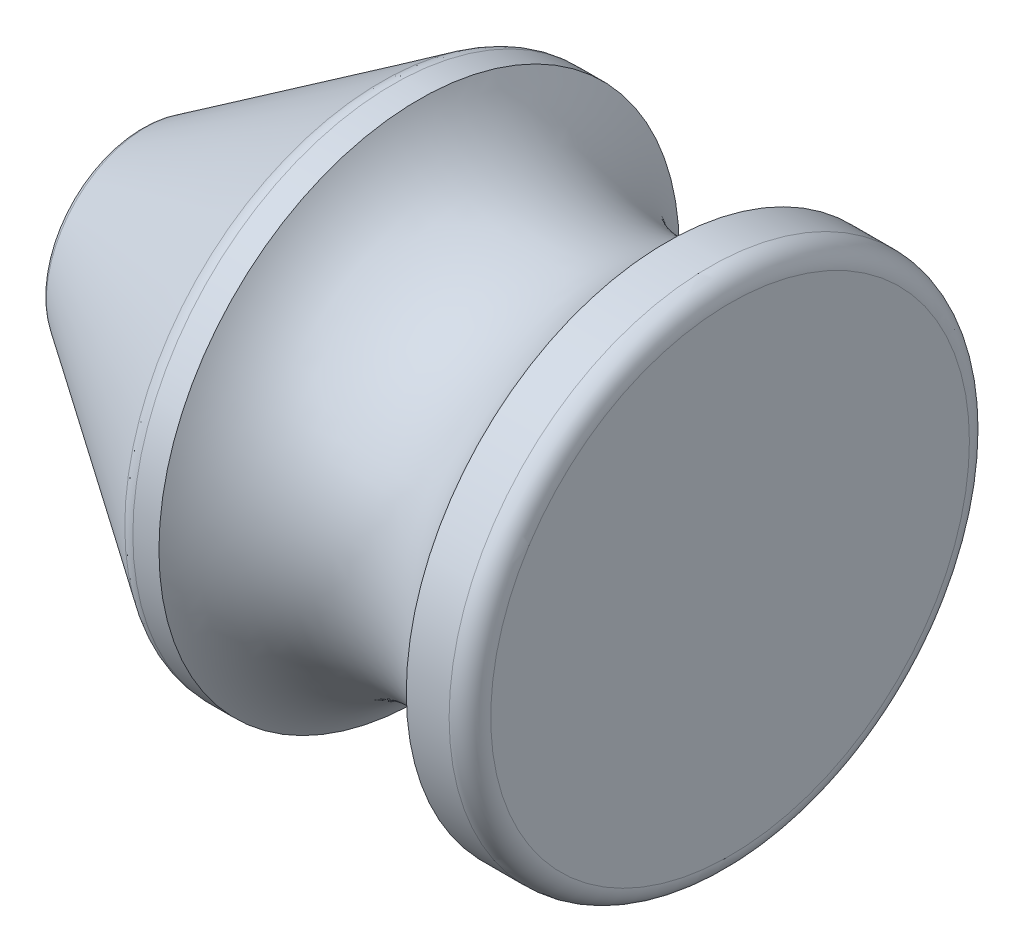
ISO-10303-21;
HEADER;
FILE_DESCRIPTION(('STEP AP214'),'2;1');
FILE_NAME('part.step','',(''),(''),'','','');
FILE_SCHEMA(('AUTOMOTIVE_DESIGN { 1 0 10303 214 1 1 1 1 }'));
ENDSEC;
DATA;
#1=APPLICATION_CONTEXT('core data for automotive mechanical design processes');
#2=APPLICATION_PROTOCOL_DEFINITION('international standard','automotive_design',2000,#1);
#3=PRODUCT_CONTEXT('',#1,'mechanical');
#4=PRODUCT('Part','Part','',(#3));
#5=PRODUCT_RELATED_PRODUCT_CATEGORY('part','',(#4));
#6=PRODUCT_DEFINITION_FORMATION('','',#4);
#7=PRODUCT_DEFINITION_CONTEXT('part definition',#1,'design');
#8=PRODUCT_DEFINITION('design','',#6,#7);
#9=PRODUCT_DEFINITION_SHAPE('','',#8);
#10=(LENGTH_UNIT() NAMED_UNIT(*) SI_UNIT(.MILLI.,.METRE.));
#11=(NAMED_UNIT(*) PLANE_ANGLE_UNIT() SI_UNIT($,.RADIAN.));
#12=(NAMED_UNIT(*) SI_UNIT($,.STERADIAN.) SOLID_ANGLE_UNIT());
#13=UNCERTAINTY_MEASURE_WITH_UNIT(LENGTH_MEASURE(1.E-05),#10,'distance_accuracy_value','');
#14=(GEOMETRIC_REPRESENTATION_CONTEXT(3) GLOBAL_UNCERTAINTY_ASSIGNED_CONTEXT((#13)) GLOBAL_UNIT_ASSIGNED_CONTEXT((#10,
#11,#12)) REPRESENTATION_CONTEXT('',''));
#15=CARTESIAN_POINT('',(0.,0.,0.));
#16=DIRECTION('',(0.,0.,1.));
#17=DIRECTION('',(1.,0.,0.));
#18=AXIS2_PLACEMENT_3D('',#15,#16,#17);
#19=CARTESIAN_POINT('',(-19.5,0.,0.));
#20=DIRECTION('',(1.,0.,0.));
#21=DIRECTION('',(0.,0.,-1.));
#22=AXIS2_PLACEMENT_3D('',#19,#20,#21);
#23=CYLINDRICAL_SURFACE('',#22,2.3);
#24=CARTESIAN_POINT('',(-3.,0.,0.));
#25=DIRECTION('',(1.,0.,0.));
#26=DIRECTION('',(0.,0.,-1.));
#27=AXIS2_PLACEMENT_3D('',#24,#25,#26);
#28=CIRCLE('',#27,2.3);
#29=CARTESIAN_POINT('',(-3.,-1.89736659610103,1.3));
#30=VERTEX_POINT('',#29);
#31=CARTESIAN_POINT('',(-3.,1.89736659610103,1.3));
#32=VERTEX_POINT('',#31);
#33=EDGE_CURVE('E86',#30,#32,#28,.T.);
#34=ORIENTED_EDGE('',*,*,#33,.T.);
#35=DIRECTION('',(1.,0.,0.));
#36=VECTOR('',#35,1.);
#37=CARTESIAN_POINT('',(-19.5,1.89736659610103,1.3));
#38=LINE('',#37,#36);
#39=CARTESIAN_POINT('',(-19.5,1.89736659610103,1.3));
#40=VERTEX_POINT('',#39);
#41=EDGE_CURVE('E76',#40,#32,#38,.T.);
#42=ORIENTED_EDGE('',*,*,#41,.F.);
#43=CARTESIAN_POINT('',(-19.5,0.,0.));
#44=DIRECTION('',(1.,0.,0.));
#45=DIRECTION('',(0.,0.,-1.));
#46=AXIS2_PLACEMENT_3D('',#43,#44,#45);
#47=CIRCLE('',#46,2.3);
#48=CARTESIAN_POINT('',(-19.5,-1.89736659610103,1.3));
#49=VERTEX_POINT('',#48);
#50=EDGE_CURVE('E99',#49,#40,#47,.T.);
#51=ORIENTED_EDGE('',*,*,#50,.F.);
#52=DIRECTION('',(1.,0.,0.));
#53=VECTOR('',#52,1.);
#54=CARTESIAN_POINT('',(-19.5,-1.89736659610103,1.3));
#55=LINE('',#54,#53);
#56=EDGE_CURVE('E83',#49,#30,#55,.T.);
#57=ORIENTED_EDGE('',*,*,#56,.T.);
#58=EDGE_LOOP('',(#34,#42,#51,#57));
#59=FACE_BOUND('',#58,.T.);
#60=ADVANCED_FACE('F49',(#59),#23,.F.);
#61=CARTESIAN_POINT('',(-19.5,0.,1.3));
#62=DIRECTION('',(0.,0.,1.));
#63=DIRECTION('',(1.,0.,0.));
#64=AXIS2_PLACEMENT_3D('',#61,#62,#63);
#65=PLANE('',#64);
#66=DIRECTION('',(0.,1.,0.));
#67=VECTOR('',#66,1.);
#68=CARTESIAN_POINT('',(-3.,0.,1.3));
#69=LINE('',#68,#67);
#70=EDGE_CURVE('E65',#30,#32,#69,.T.);
#71=ORIENTED_EDGE('',*,*,#70,.F.);
#72=ORIENTED_EDGE('',*,*,#56,.F.);
#73=DIRECTION('',(0.,-1.,0.));
#74=VECTOR('',#73,1.);
#75=CARTESIAN_POINT('',(-19.5,0.,1.3));
#76=LINE('',#75,#74);
#77=EDGE_CURVE('E70',#40,#49,#76,.T.);
#78=ORIENTED_EDGE('',*,*,#77,.F.);
#79=ORIENTED_EDGE('',*,*,#41,.T.);
#80=EDGE_LOOP('',(#71,#72,#78,#79));
#81=FACE_BOUND('',#80,.T.);
#82=ADVANCED_FACE('F78',(#81),#65,.F.);
#83=CARTESIAN_POINT('',(-19.5,0.,0.));
#84=DIRECTION('',(1.,0.,0.));
#85=DIRECTION('',(0.,0.,-1.));
#86=AXIS2_PLACEMENT_3D('',#83,#84,#85);
#87=CYLINDRICAL_SURFACE('',#86,12.5);
#88=CARTESIAN_POINT('',(8.,0.,0.));
#89=DIRECTION('',(1.,0.,0.));
#90=DIRECTION('',(0.,0.,-1.));
#91=AXIS2_PLACEMENT_3D('',#88,#89,#90);
#92=CIRCLE('',#91,12.5);
#93=CARTESIAN_POINT('',(8.,0.,-12.5));
#94=VERTEX_POINT('',#93);
#95=EDGE_CURVE('E11',#94,#94,#92,.F.);
#96=ORIENTED_EDGE('',*,*,#95,.T.);
#97=EDGE_LOOP('',(#96));
#98=FACE_BOUND('',#97,.T.);
#99=CARTESIAN_POINT('',(5.94222180669823,0.,0.));
#100=DIRECTION('',(-1.,0.,0.));
#101=DIRECTION('',(0.,0.,1.));
#102=AXIS2_PLACEMENT_3D('',#99,#100,#101);
#103=CIRCLE('',#102,12.5);
#104=CARTESIAN_POINT('',(5.94222180669823,0.,12.5));
#105=VERTEX_POINT('',#104);
#106=EDGE_CURVE('E96',#105,#105,#103,.F.);
#107=ORIENTED_EDGE('',*,*,#106,.T.);
#108=EDGE_LOOP('',(#107));
#109=FACE_BOUND('',#108,.T.);
#110=ADVANCED_FACE('F146',(#98,#109),#87,.T.);
#111=CARTESIAN_POINT('',(-7.19722436226794,0.,0.));
#112=DIRECTION('',(-1.,0.,0.));
#113=DIRECTION('',(0.,0.,1.));
#114=AXIS2_PLACEMENT_3D('',#111,#112,#113);
#115=CIRCLE('',#114,12.5);
#116=CARTESIAN_POINT('',(-7.19722436226794,0.,12.5));
#117=VERTEX_POINT('',#116);
#118=EDGE_CURVE('E82',#117,#117,#115,.F.);
#119=ORIENTED_EDGE('',*,*,#118,.T.);
#120=EDGE_LOOP('',(#119));
#121=FACE_BOUND('',#120,.T.);
#122=CARTESIAN_POINT('',(-5.94222180669823,0.,0.));
#123=DIRECTION('',(1.,0.,0.));
#124=DIRECTION('',(0.,0.,-1.));
#125=AXIS2_PLACEMENT_3D('',#122,#123,#124);
#126=CIRCLE('',#125,12.5);
#127=CARTESIAN_POINT('',(-5.94222180669823,0.,-12.5));
#128=VERTEX_POINT('',#127);
#129=EDGE_CURVE('E92',#128,#128,#126,.F.);
#130=ORIENTED_EDGE('',*,*,#129,.T.);
#131=EDGE_LOOP('',(#130));
#132=FACE_BOUND('',#131,.T.);
#133=ADVANCED_FACE('F166',(#121,#132),#87,.T.);
#134=CARTESIAN_POINT('',(-19.5,0.,0.));
#135=DIRECTION('',(1.,0.,0.));
#136=DIRECTION('',(0.,0.,-1.));
#137=AXIS2_PLACEMENT_3D('',#134,#135,#136);
#138=PLANE('',#137);
#139=CARTESIAN_POINT('',(-19.5,0.,0.));
#140=DIRECTION('',(1.,0.,0.));
#141=DIRECTION('',(0.,0.,-1.));
#142=AXIS2_PLACEMENT_3D('',#139,#140,#141);
#143=CIRCLE('',#142,3.96481624151199);
#144=CARTESIAN_POINT('',(-19.5,0.,-3.96481624151199));
#145=VERTEX_POINT('',#144);
#146=EDGE_CURVE('E120',#145,#145,#143,.F.);
#147=ORIENTED_EDGE('',*,*,#146,.T.);
#148=EDGE_LOOP('',(#147));
#149=FACE_BOUND('',#148,.T.);
#150=ORIENTED_EDGE('',*,*,#50,.T.);
#151=ORIENTED_EDGE('',*,*,#77,.T.);
#152=EDGE_LOOP('',(#150,#151));
#153=FACE_BOUND('',#152,.T.);
#154=ADVANCED_FACE('F169',(#149,#153),#138,.F.);
#155=CARTESIAN_POINT('',(9.,0.,0.));
#156=DIRECTION('',(1.,0.,0.));
#157=DIRECTION('',(0.,0.,-1.));
#158=AXIS2_PLACEMENT_3D('',#155,#156,#157);
#159=PLANE('',#158);
#160=CARTESIAN_POINT('',(9.,0.,0.));
#161=DIRECTION('',(1.,0.,0.));
#162=DIRECTION('',(0.,0.,-1.));
#163=AXIS2_PLACEMENT_3D('',#160,#161,#162);
#164=CIRCLE('',#163,11.5);
#165=CARTESIAN_POINT('',(9.,0.,-11.5));
#166=VERTEX_POINT('',#165);
#167=EDGE_CURVE('E58',#166,#166,#164,.T.);
#168=ORIENTED_EDGE('',*,*,#167,.T.);
#169=EDGE_LOOP('',(#168));
#170=FACE_BOUND('',#169,.T.);
#171=ADVANCED_FACE('F127',(#170),#159,.T.);
#172=CARTESIAN_POINT('',(0.,0.,0.));
#173=DIRECTION('',(1.,0.,0.));
#174=DIRECTION('',(0.,0.,-1.));
#175=AXIS2_PLACEMENT_3D('',#172,#173,#174);
#176=TOROIDAL_SURFACE('',#175,16.2,7.);
#177=ORIENTED_EDGE('',*,*,#106,.F.);
#178=EDGE_LOOP('',(#177));
#179=FACE_BOUND('',#178,.T.);
#180=ORIENTED_EDGE('',*,*,#129,.F.);
#181=EDGE_LOOP('',(#180));
#182=FACE_BOUND('',#181,.T.);
#183=ADVANCED_FACE('F156',(#179,#182),#176,.F.);
#184=CARTESIAN_POINT('',(-7.49999999999993,0.,0.));
#185=DIRECTION('',(1.,0.,0.));
#186=DIRECTION('',(0.,0.,-1.));
#187=AXIS2_PLACEMENT_3D('',#184,#185,#186);
#188=CONICAL_SURFACE('',#187,12.5,0.588002603547566);
#189=CARTESIAN_POINT('',(-7.75192455849317,0.,0.));
#190=DIRECTION('',(-1.,0.,0.));
#191=DIRECTION('',(0.,0.,1.));
#192=AXIS2_PLACEMENT_3D('',#189,#190,#191);
#193=CIRCLE('',#192,12.3320502943378);
#194=CARTESIAN_POINT('',(-7.75192455849317,0.,12.3320502943378));
#195=VERTEX_POINT('',#194);
#196=EDGE_CURVE('E116',#195,#195,#193,.T.);
#197=ORIENTED_EDGE('',*,*,#196,.T.);
#198=EDGE_LOOP('',(#197));
#199=FACE_BOUND('',#198,.T.);
#200=CARTESIAN_POINT('',(-19.0547001962252,0.,0.));
#201=DIRECTION('',(1.,0.,0.));
#202=DIRECTION('',(0.,0.,-1.));
#203=AXIS2_PLACEMENT_3D('',#200,#201,#202);
#204=CIRCLE('',#203,4.79686653584983);
#205=CARTESIAN_POINT('',(-19.0547001962252,0.,-4.79686653584983));
#206=VERTEX_POINT('',#205);
#207=EDGE_CURVE('E112',#206,#206,#204,.T.);
#208=ORIENTED_EDGE('',*,*,#207,.T.);
#209=EDGE_LOOP('',(#208));
#210=FACE_BOUND('',#209,.T.);
#211=ADVANCED_FACE('F151',(#199,#210),#188,.T.);
#212=CARTESIAN_POINT('',(-7.19722436226794,0.,0.));
#213=DIRECTION('',(-1.,0.,0.));
#214=DIRECTION('',(0.,0.,1.));
#215=AXIS2_PLACEMENT_3D('',#212,#213,#214);
#216=TOROIDAL_SURFACE('',#215,11.5,1.);
#217=ORIENTED_EDGE('',*,*,#196,.F.);
#218=EDGE_LOOP('',(#217));
#219=FACE_BOUND('',#218,.T.);
#220=ORIENTED_EDGE('',*,*,#118,.F.);
#221=EDGE_LOOP('',(#220));
#222=FACE_BOUND('',#221,.T.);
#223=ADVANCED_FACE('F139',(#219,#222),#216,.T.);
#224=CARTESIAN_POINT('',(-18.5,0.,0.));
#225=DIRECTION('',(1.,0.,0.));
#226=DIRECTION('',(0.,0.,-1.));
#227=AXIS2_PLACEMENT_3D('',#224,#225,#226);
#228=TOROIDAL_SURFACE('',#227,3.96481624151199,1.);
#229=ORIENTED_EDGE('',*,*,#207,.F.);
#230=EDGE_LOOP('',(#229));
#231=FACE_BOUND('',#230,.T.);
#232=ORIENTED_EDGE('',*,*,#146,.F.);
#233=EDGE_LOOP('',(#232));
#234=FACE_BOUND('',#233,.T.);
#235=ADVANCED_FACE('F130',(#231,#234),#228,.T.);
#236=CARTESIAN_POINT('',(8.,0.,0.));
#237=DIRECTION('',(1.,0.,0.));
#238=DIRECTION('',(0.,0.,-1.));
#239=AXIS2_PLACEMENT_3D('',#236,#237,#238);
#240=TOROIDAL_SURFACE('',#239,11.5,1.);
#241=ORIENTED_EDGE('',*,*,#95,.F.);
#242=EDGE_LOOP('',(#241));
#243=FACE_BOUND('',#242,.T.);
#244=ORIENTED_EDGE('',*,*,#167,.F.);
#245=EDGE_LOOP('',(#244));
#246=FACE_BOUND('',#245,.T.);
#247=ADVANCED_FACE('F51',(#243,#246),#240,.T.);
#248=CARTESIAN_POINT('',(-3.,0.,0.));
#249=DIRECTION('',(1.,0.,0.));
#250=DIRECTION('',(0.,0.,-1.));
#251=AXIS2_PLACEMENT_3D('',#248,#249,#250);
#252=PLANE('',#251);
#253=ORIENTED_EDGE('',*,*,#33,.F.);
#254=ORIENTED_EDGE('',*,*,#70,.T.);
#255=EDGE_LOOP('',(#253,#254));
#256=FACE_BOUND('',#255,.T.);
#257=ADVANCED_FACE('F90',(#256),#252,.F.);
#258=CLOSED_SHELL('',(#60,#82,#110,#133,#154,#171,#183,#211,#223,#235,#247,#257));
#259=MANIFOLD_SOLID_BREP('B2',#258);
#260=ADVANCED_BREP_SHAPE_REPRESENTATION('',(#18,#259),#14);
#261=SHAPE_DEFINITION_REPRESENTATION(#9,#260);
ENDSEC;
END-ISO-10303-21;
